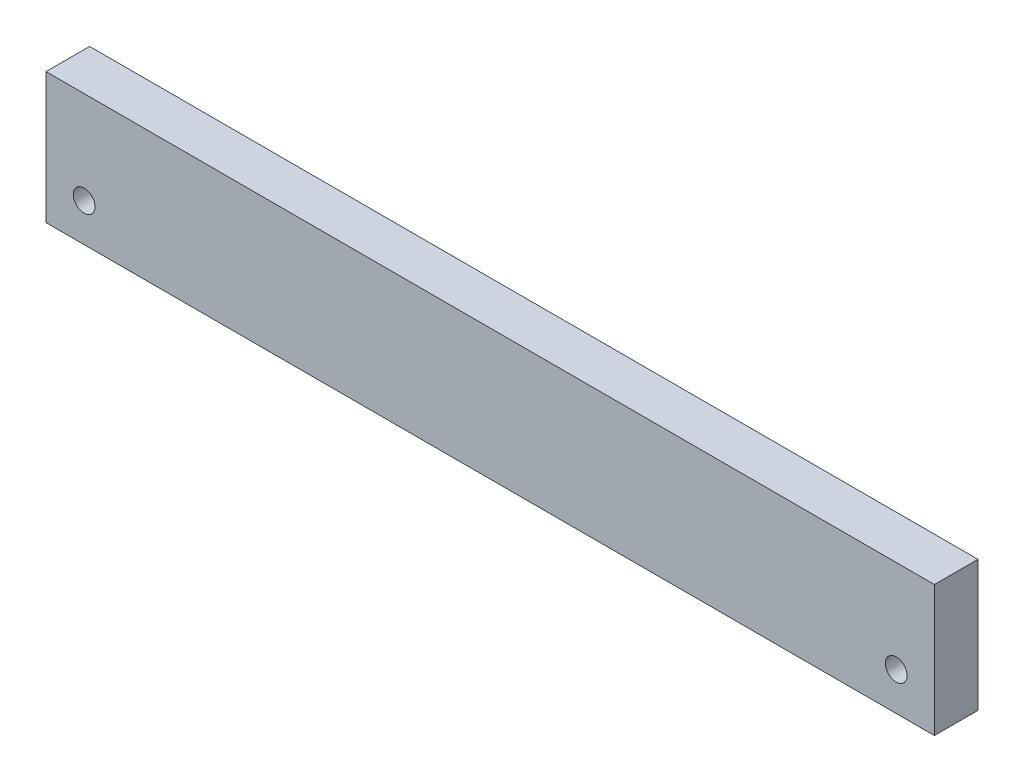
ISO-10303-21;
HEADER;
FILE_DESCRIPTION(('STEP AP214'),'2;1');
FILE_NAME('part.step','',(''),(''),'','','');
FILE_SCHEMA(('AUTOMOTIVE_DESIGN { 1 0 10303 214 1 1 1 1 }'));
ENDSEC;
DATA;
#1=APPLICATION_CONTEXT('core data for automotive mechanical design processes');
#2=APPLICATION_PROTOCOL_DEFINITION('international standard','automotive_design',2000,#1);
#3=PRODUCT_CONTEXT('',#1,'mechanical');
#4=PRODUCT('Part','Part','',(#3));
#5=PRODUCT_RELATED_PRODUCT_CATEGORY('part','',(#4));
#6=PRODUCT_DEFINITION_FORMATION('','',#4);
#7=PRODUCT_DEFINITION_CONTEXT('part definition',#1,'design');
#8=PRODUCT_DEFINITION('design','',#6,#7);
#9=PRODUCT_DEFINITION_SHAPE('','',#8);
#10=(LENGTH_UNIT() NAMED_UNIT(*) SI_UNIT(.MILLI.,.METRE.));
#11=(NAMED_UNIT(*) PLANE_ANGLE_UNIT() SI_UNIT($,.RADIAN.));
#12=(NAMED_UNIT(*) SI_UNIT($,.STERADIAN.) SOLID_ANGLE_UNIT());
#13=UNCERTAINTY_MEASURE_WITH_UNIT(LENGTH_MEASURE(1.E-05),#10,'distance_accuracy_value','');
#14=(GEOMETRIC_REPRESENTATION_CONTEXT(3) GLOBAL_UNCERTAINTY_ASSIGNED_CONTEXT((#13)) GLOBAL_UNIT_ASSIGNED_CONTEXT((#10,
#11,#12)) REPRESENTATION_CONTEXT('',''));
#15=CARTESIAN_POINT('',(0.,0.,0.));
#16=DIRECTION('',(0.,0.,1.));
#17=DIRECTION('',(1.,0.,0.));
#18=AXIS2_PLACEMENT_3D('',#15,#16,#17);
#19=CARTESIAN_POINT('',(0.,0.,4.));
#20=DIRECTION('',(0.,0.,-1.));
#21=DIRECTION('',(-1.,0.,0.));
#22=AXIS2_PLACEMENT_3D('',#19,#20,#21);
#23=PLANE('',#22);
#24=DIRECTION('',(0.,1.,0.));
#25=VECTOR('',#24,1.);
#26=CARTESIAN_POINT('',(40.7500000000001,-6.,4.));
#27=LINE('',#26,#25);
#28=CARTESIAN_POINT('',(40.7500000000001,-6.,4.));
#29=VERTEX_POINT('',#28);
#30=CARTESIAN_POINT('',(40.7500000000001,6.,4.));
#31=VERTEX_POINT('',#30);
#32=EDGE_CURVE('E92',#29,#31,#27,.T.);
#33=ORIENTED_EDGE('',*,*,#32,.T.);
#34=DIRECTION('',(-1.,0.,0.));
#35=VECTOR('',#34,1.);
#36=CARTESIAN_POINT('',(-40.7499999999999,6.,4.));
#37=LINE('',#36,#35);
#38=CARTESIAN_POINT('',(-40.7499999999999,6.,4.));
#39=VERTEX_POINT('',#38);
#40=EDGE_CURVE('E87',#31,#39,#37,.T.);
#41=ORIENTED_EDGE('',*,*,#40,.T.);
#42=DIRECTION('',(0.,-1.,0.));
#43=VECTOR('',#42,1.);
#44=CARTESIAN_POINT('',(-40.7499999999999,-6.,4.));
#45=LINE('',#44,#43);
#46=CARTESIAN_POINT('',(-40.7499999999999,-6.,4.));
#47=VERTEX_POINT('',#46);
#48=EDGE_CURVE('E90',#39,#47,#45,.T.);
#49=ORIENTED_EDGE('',*,*,#48,.T.);
#50=DIRECTION('',(1.,0.,0.));
#51=VECTOR('',#50,1.);
#52=CARTESIAN_POINT('',(-40.7499999999999,-6.,4.));
#53=LINE('',#52,#51);
#54=EDGE_CURVE('E57',#47,#29,#53,.T.);
#55=ORIENTED_EDGE('',*,*,#54,.T.);
#56=EDGE_LOOP('',(#33,#41,#49,#55));
#57=FACE_BOUND('',#56,.T.);
#58=CARTESIAN_POINT('',(-37.2499999999999,-2.5,4.));
#59=DIRECTION('',(0.,0.,1.));
#60=DIRECTION('',(1.,0.,0.));
#61=AXIS2_PLACEMENT_3D('',#58,#59,#60);
#62=CIRCLE('',#61,0.999999999999998);
#63=CARTESIAN_POINT('',(-36.2499999999999,-2.5,4.));
#64=VERTEX_POINT('',#63);
#65=EDGE_CURVE('E112',#64,#64,#62,.T.);
#66=ORIENTED_EDGE('',*,*,#65,.F.);
#67=EDGE_LOOP('',(#66));
#68=FACE_BOUND('',#67,.T.);
#69=CARTESIAN_POINT('',(37.2500000000001,-2.5,4.));
#70=DIRECTION('',(0.,0.,1.));
#71=DIRECTION('',(-1.,0.,0.));
#72=AXIS2_PLACEMENT_3D('',#69,#70,#71);
#73=CIRCLE('',#72,0.999999999999998);
#74=CARTESIAN_POINT('',(36.2500000000001,-2.5,4.));
#75=VERTEX_POINT('',#74);
#76=EDGE_CURVE('E134',#75,#75,#73,.T.);
#77=ORIENTED_EDGE('',*,*,#76,.F.);
#78=EDGE_LOOP('',(#77));
#79=FACE_BOUND('',#78,.T.);
#80=ADVANCED_FACE('F39',(#57,#68,#79),#23,.F.);
#81=CARTESIAN_POINT('',(0.,0.,0.));
#82=DIRECTION('',(0.,0.,-1.));
#83=DIRECTION('',(-1.,0.,0.));
#84=AXIS2_PLACEMENT_3D('',#81,#82,#83);
#85=PLANE('',#84);
#86=CARTESIAN_POINT('',(-37.2499999999999,-2.5,0.));
#87=DIRECTION('',(0.,0.,1.));
#88=DIRECTION('',(1.,0.,0.));
#89=AXIS2_PLACEMENT_3D('',#86,#87,#88);
#90=CIRCLE('',#89,0.999999999999998);
#91=CARTESIAN_POINT('',(-36.2499999999999,-2.5,0.));
#92=VERTEX_POINT('',#91);
#93=EDGE_CURVE('E130',#92,#92,#90,.T.);
#94=ORIENTED_EDGE('',*,*,#93,.T.);
#95=EDGE_LOOP('',(#94));
#96=FACE_BOUND('',#95,.T.);
#97=DIRECTION('',(0.,1.,0.));
#98=VECTOR('',#97,1.);
#99=CARTESIAN_POINT('',(40.7500000000001,-6.,0.));
#100=LINE('',#99,#98);
#101=CARTESIAN_POINT('',(40.7500000000001,-6.,0.));
#102=VERTEX_POINT('',#101);
#103=CARTESIAN_POINT('',(40.7500000000001,6.,0.));
#104=VERTEX_POINT('',#103);
#105=EDGE_CURVE('E108',#102,#104,#100,.T.);
#106=ORIENTED_EDGE('',*,*,#105,.F.);
#107=DIRECTION('',(1.,0.,0.));
#108=VECTOR('',#107,1.);
#109=CARTESIAN_POINT('',(-40.7499999999999,-6.,0.));
#110=LINE('',#109,#108);
#111=CARTESIAN_POINT('',(-40.7499999999999,-6.,0.));
#112=VERTEX_POINT('',#111);
#113=EDGE_CURVE('E80',#112,#102,#110,.T.);
#114=ORIENTED_EDGE('',*,*,#113,.F.);
#115=DIRECTION('',(0.,-1.,0.));
#116=VECTOR('',#115,1.);
#117=CARTESIAN_POINT('',(-40.7499999999999,-6.,0.));
#118=LINE('',#117,#116);
#119=CARTESIAN_POINT('',(-40.7499999999999,6.,0.));
#120=VERTEX_POINT('',#119);
#121=EDGE_CURVE('E74',#120,#112,#118,.T.);
#122=ORIENTED_EDGE('',*,*,#121,.F.);
#123=DIRECTION('',(-1.,0.,0.));
#124=VECTOR('',#123,1.);
#125=CARTESIAN_POINT('',(-40.7499999999999,6.,0.));
#126=LINE('',#125,#124);
#127=EDGE_CURVE('E97',#104,#120,#126,.T.);
#128=ORIENTED_EDGE('',*,*,#127,.F.);
#129=EDGE_LOOP('',(#106,#114,#122,#128));
#130=FACE_BOUND('',#129,.T.);
#131=CARTESIAN_POINT('',(37.2500000000001,-2.5,0.));
#132=DIRECTION('',(0.,0.,1.));
#133=DIRECTION('',(-1.,0.,0.));
#134=AXIS2_PLACEMENT_3D('',#131,#132,#133);
#135=CIRCLE('',#134,0.999999999999998);
#136=CARTESIAN_POINT('',(36.2500000000001,-2.5,0.));
#137=VERTEX_POINT('',#136);
#138=EDGE_CURVE('E138',#137,#137,#135,.T.);
#139=ORIENTED_EDGE('',*,*,#138,.T.);
#140=EDGE_LOOP('',(#139));
#141=FACE_BOUND('',#140,.T.);
#142=ADVANCED_FACE('F125',(#96,#130,#141),#85,.T.);
#143=CARTESIAN_POINT('',(40.7500000000001,-6.,4.));
#144=DIRECTION('',(-1.,0.,0.));
#145=DIRECTION('',(0.,0.,1.));
#146=AXIS2_PLACEMENT_3D('',#143,#144,#145);
#147=PLANE('',#146);
#148=ORIENTED_EDGE('',*,*,#105,.T.);
#149=DIRECTION('',(0.,0.,-1.));
#150=VECTOR('',#149,1.);
#151=CARTESIAN_POINT('',(40.7500000000001,6.,4.));
#152=LINE('',#151,#150);
#153=EDGE_CURVE('E11',#31,#104,#152,.T.);
#154=ORIENTED_EDGE('',*,*,#153,.F.);
#155=ORIENTED_EDGE('',*,*,#32,.F.);
#156=DIRECTION('',(0.,0.,-1.));
#157=VECTOR('',#156,1.);
#158=CARTESIAN_POINT('',(40.7500000000001,-6.,4.));
#159=LINE('',#158,#157);
#160=EDGE_CURVE('E104',#29,#102,#159,.T.);
#161=ORIENTED_EDGE('',*,*,#160,.T.);
#162=EDGE_LOOP('',(#148,#154,#155,#161));
#163=FACE_BOUND('',#162,.T.);
#164=ADVANCED_FACE('F41',(#163),#147,.F.);
#165=CARTESIAN_POINT('',(-40.7499999999999,6.,4.));
#166=DIRECTION('',(0.,-1.,0.));
#167=DIRECTION('',(0.,0.,-1.));
#168=AXIS2_PLACEMENT_3D('',#165,#166,#167);
#169=PLANE('',#168);
#170=ORIENTED_EDGE('',*,*,#127,.T.);
#171=DIRECTION('',(0.,0.,-1.));
#172=VECTOR('',#171,1.);
#173=CARTESIAN_POINT('',(-40.7499999999999,6.,4.));
#174=LINE('',#173,#172);
#175=EDGE_CURVE('E49',#39,#120,#174,.T.);
#176=ORIENTED_EDGE('',*,*,#175,.F.);
#177=ORIENTED_EDGE('',*,*,#40,.F.);
#178=ORIENTED_EDGE('',*,*,#153,.T.);
#179=EDGE_LOOP('',(#170,#176,#177,#178));
#180=FACE_BOUND('',#179,.T.);
#181=ADVANCED_FACE('F96',(#180),#169,.F.);
#182=CARTESIAN_POINT('',(-40.7499999999999,-6.,4.));
#183=DIRECTION('',(1.,0.,0.));
#184=DIRECTION('',(0.,0.,-1.));
#185=AXIS2_PLACEMENT_3D('',#182,#183,#184);
#186=PLANE('',#185);
#187=ORIENTED_EDGE('',*,*,#121,.T.);
#188=DIRECTION('',(0.,0.,-1.));
#189=VECTOR('',#188,1.);
#190=CARTESIAN_POINT('',(-40.7499999999999,-6.,4.));
#191=LINE('',#190,#189);
#192=EDGE_CURVE('E99',#47,#112,#191,.T.);
#193=ORIENTED_EDGE('',*,*,#192,.F.);
#194=ORIENTED_EDGE('',*,*,#48,.F.);
#195=ORIENTED_EDGE('',*,*,#175,.T.);
#196=EDGE_LOOP('',(#187,#193,#194,#195));
#197=FACE_BOUND('',#196,.T.);
#198=ADVANCED_FACE('F100',(#197),#186,.F.);
#199=CARTESIAN_POINT('',(-40.7499999999999,-6.,4.));
#200=DIRECTION('',(0.,1.,0.));
#201=DIRECTION('',(0.,0.,1.));
#202=AXIS2_PLACEMENT_3D('',#199,#200,#201);
#203=PLANE('',#202);
#204=ORIENTED_EDGE('',*,*,#113,.T.);
#205=ORIENTED_EDGE('',*,*,#160,.F.);
#206=ORIENTED_EDGE('',*,*,#54,.F.);
#207=ORIENTED_EDGE('',*,*,#192,.T.);
#208=EDGE_LOOP('',(#204,#205,#206,#207));
#209=FACE_BOUND('',#208,.T.);
#210=ADVANCED_FACE('F122',(#209),#203,.F.);
#211=CARTESIAN_POINT('',(-37.2499999999999,-2.5,4.));
#212=DIRECTION('',(0.,0.,-1.));
#213=DIRECTION('',(-1.,0.,0.));
#214=AXIS2_PLACEMENT_3D('',#211,#212,#213);
#215=CYLINDRICAL_SURFACE('',#214,0.999999999999998);
#216=ORIENTED_EDGE('',*,*,#65,.T.);
#217=EDGE_LOOP('',(#216));
#218=FACE_BOUND('',#217,.T.);
#219=ORIENTED_EDGE('',*,*,#93,.F.);
#220=EDGE_LOOP('',(#219));
#221=FACE_BOUND('',#220,.T.);
#222=ADVANCED_FACE('F157',(#218,#221),#215,.F.);
#223=CARTESIAN_POINT('',(37.2500000000001,-2.5,4.));
#224=DIRECTION('',(0.,0.,-1.));
#225=DIRECTION('',(-1.,0.,0.));
#226=AXIS2_PLACEMENT_3D('',#223,#224,#225);
#227=CYLINDRICAL_SURFACE('',#226,0.999999999999998);
#228=ORIENTED_EDGE('',*,*,#76,.T.);
#229=EDGE_LOOP('',(#228));
#230=FACE_BOUND('',#229,.T.);
#231=ORIENTED_EDGE('',*,*,#138,.F.);
#232=EDGE_LOOP('',(#231));
#233=FACE_BOUND('',#232,.T.);
#234=ADVANCED_FACE('F146',(#230,#233),#227,.F.);
#235=CLOSED_SHELL('',(#80,#142,#164,#181,#198,#210,#222,#234));
#236=MANIFOLD_SOLID_BREP('B2',#235);
#237=ADVANCED_BREP_SHAPE_REPRESENTATION('',(#18,#236),#14);
#238=SHAPE_DEFINITION_REPRESENTATION(#9,#237);
ENDSEC;
END-ISO-10303-21;
